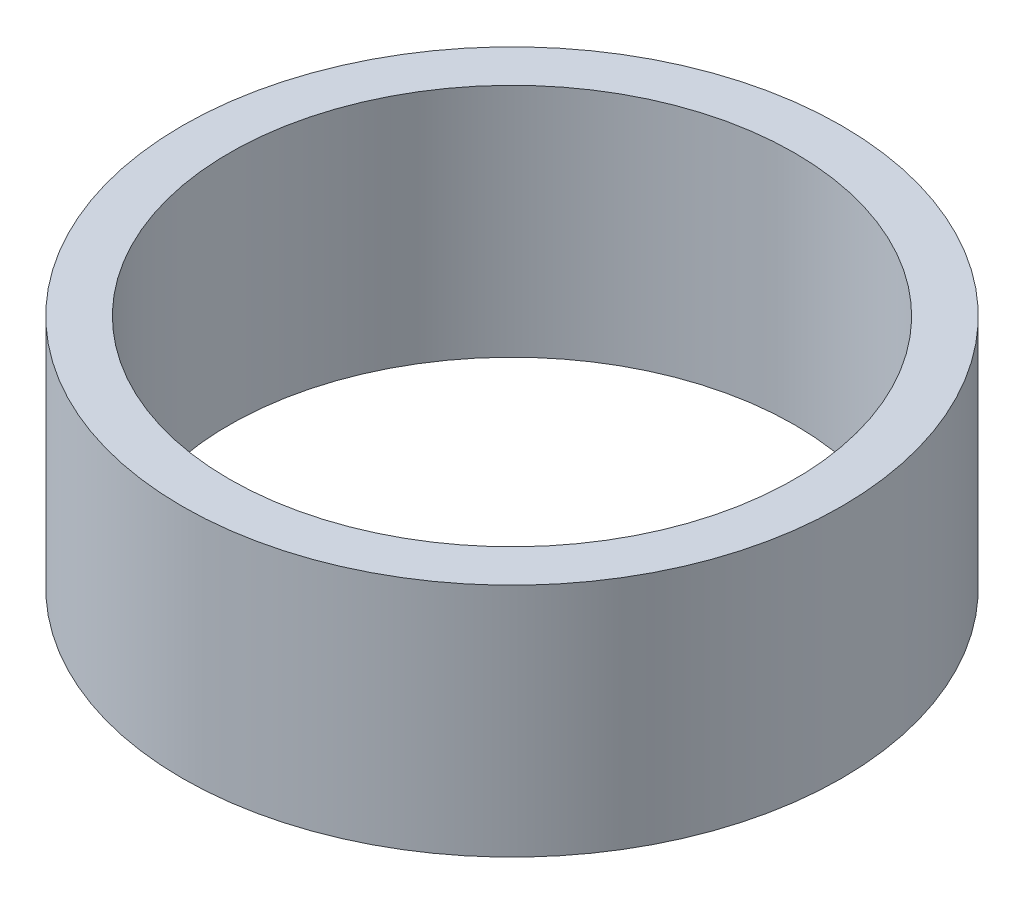
ISO-10303-21;
HEADER;
FILE_DESCRIPTION(('STEP AP214'),'2;1');
FILE_NAME('part.step','',(''),(''),'','','');
FILE_SCHEMA(('AUTOMOTIVE_DESIGN { 1 0 10303 214 1 1 1 1 }'));
ENDSEC;
DATA;
#1=APPLICATION_CONTEXT('core data for automotive mechanical design processes');
#2=APPLICATION_PROTOCOL_DEFINITION('international standard','automotive_design',2000,#1);
#3=PRODUCT_CONTEXT('',#1,'mechanical');
#4=PRODUCT('Part','Part','',(#3));
#5=PRODUCT_RELATED_PRODUCT_CATEGORY('part','',(#4));
#6=PRODUCT_DEFINITION_FORMATION('','',#4);
#7=PRODUCT_DEFINITION_CONTEXT('part definition',#1,'design');
#8=PRODUCT_DEFINITION('design','',#6,#7);
#9=PRODUCT_DEFINITION_SHAPE('','',#8);
#10=(LENGTH_UNIT() NAMED_UNIT(*) SI_UNIT(.MILLI.,.METRE.));
#11=(NAMED_UNIT(*) PLANE_ANGLE_UNIT() SI_UNIT($,.RADIAN.));
#12=(NAMED_UNIT(*) SI_UNIT($,.STERADIAN.) SOLID_ANGLE_UNIT());
#13=UNCERTAINTY_MEASURE_WITH_UNIT(LENGTH_MEASURE(1.E-05),#10,'distance_accuracy_value','');
#14=(GEOMETRIC_REPRESENTATION_CONTEXT(3) GLOBAL_UNCERTAINTY_ASSIGNED_CONTEXT((#13)) GLOBAL_UNIT_ASSIGNED_CONTEXT((#10,
#11,#12)) REPRESENTATION_CONTEXT('',''));
#15=CARTESIAN_POINT('',(0.,0.,0.));
#16=DIRECTION('',(0.,0.,1.));
#17=DIRECTION('',(1.,0.,0.));
#18=AXIS2_PLACEMENT_3D('',#15,#16,#17);
#19=CARTESIAN_POINT('',(0.,15.875,0.));
#20=DIRECTION('',(0.,1.,0.));
#21=DIRECTION('',(0.,0.,1.));
#22=AXIS2_PLACEMENT_3D('',#19,#20,#21);
#23=PLANE('',#22);
#24=CARTESIAN_POINT('',(0.,15.875,0.));
#25=DIRECTION('',(0.,1.,0.));
#26=DIRECTION('',(0.,0.,1.));
#27=AXIS2_PLACEMENT_3D('',#24,#25,#26);
#28=CIRCLE('',#27,22.225);
#29=CARTESIAN_POINT('',(0.,15.875,22.225));
#30=VERTEX_POINT('',#29);
#31=EDGE_CURVE('E10',#30,#30,#28,.T.);
#32=ORIENTED_EDGE('',*,*,#31,.T.);
#33=EDGE_LOOP('',(#32));
#34=FACE_BOUND('',#33,.T.);
#35=CARTESIAN_POINT('',(0.,15.875,0.));
#36=DIRECTION('',(0.,1.,0.));
#37=DIRECTION('',(0.,0.,1.));
#38=AXIS2_PLACEMENT_3D('',#35,#36,#37);
#39=CIRCLE('',#38,19.05);
#40=CARTESIAN_POINT('',(0.,15.875,19.05));
#41=VERTEX_POINT('',#40);
#42=EDGE_CURVE('E42',#41,#41,#39,.T.);
#43=ORIENTED_EDGE('',*,*,#42,.F.);
#44=EDGE_LOOP('',(#43));
#45=FACE_BOUND('',#44,.T.);
#46=ADVANCED_FACE('F31',(#34,#45),#23,.T.);
#47=CARTESIAN_POINT('',(0.,0.,0.));
#48=DIRECTION('',(0.,1.,0.));
#49=DIRECTION('',(0.,0.,1.));
#50=AXIS2_PLACEMENT_3D('',#47,#48,#49);
#51=PLANE('',#50);
#52=CARTESIAN_POINT('',(0.,0.,0.));
#53=DIRECTION('',(0.,1.,0.));
#54=DIRECTION('',(0.,0.,1.));
#55=AXIS2_PLACEMENT_3D('',#52,#53,#54);
#56=CIRCLE('',#55,22.225);
#57=CARTESIAN_POINT('',(0.,0.,22.225));
#58=VERTEX_POINT('',#57);
#59=EDGE_CURVE('E35',#58,#58,#56,.T.);
#60=ORIENTED_EDGE('',*,*,#59,.F.);
#61=EDGE_LOOP('',(#60));
#62=FACE_BOUND('',#61,.T.);
#63=CARTESIAN_POINT('',(0.,0.,0.));
#64=DIRECTION('',(0.,1.,0.));
#65=DIRECTION('',(0.,0.,1.));
#66=AXIS2_PLACEMENT_3D('',#63,#64,#65);
#67=CIRCLE('',#66,19.05);
#68=CARTESIAN_POINT('',(0.,0.,19.05));
#69=VERTEX_POINT('',#68);
#70=EDGE_CURVE('E44',#69,#69,#67,.T.);
#71=ORIENTED_EDGE('',*,*,#70,.T.);
#72=EDGE_LOOP('',(#71));
#73=FACE_BOUND('',#72,.T.);
#74=ADVANCED_FACE('F54',(#62,#73),#51,.F.);
#75=CARTESIAN_POINT('',(0.,15.875,0.));
#76=DIRECTION('',(0.,-1.,0.));
#77=DIRECTION('',(0.,0.,-1.));
#78=AXIS2_PLACEMENT_3D('',#75,#76,#77);
#79=CYLINDRICAL_SURFACE('',#78,22.225);
#80=ORIENTED_EDGE('',*,*,#31,.F.);
#81=EDGE_LOOP('',(#80));
#82=FACE_BOUND('',#81,.T.);
#83=ORIENTED_EDGE('',*,*,#59,.T.);
#84=EDGE_LOOP('',(#83));
#85=FACE_BOUND('',#84,.T.);
#86=ADVANCED_FACE('F33',(#82,#85),#79,.T.);
#87=CARTESIAN_POINT('',(0.,15.875,0.));
#88=DIRECTION('',(0.,-1.,0.));
#89=DIRECTION('',(0.,0.,-1.));
#90=AXIS2_PLACEMENT_3D('',#87,#88,#89);
#91=CYLINDRICAL_SURFACE('',#90,19.05);
#92=ORIENTED_EDGE('',*,*,#42,.T.);
#93=EDGE_LOOP('',(#92));
#94=FACE_BOUND('',#93,.T.);
#95=ORIENTED_EDGE('',*,*,#70,.F.);
#96=EDGE_LOOP('',(#95));
#97=FACE_BOUND('',#96,.T.);
#98=ADVANCED_FACE('F50',(#94,#97),#91,.F.);
#99=CLOSED_SHELL('',(#46,#74,#86,#98));
#100=MANIFOLD_SOLID_BREP('B2',#99);
#101=ADVANCED_BREP_SHAPE_REPRESENTATION('',(#18,#100),#14);
#102=SHAPE_DEFINITION_REPRESENTATION(#9,#101);
ENDSEC;
END-ISO-10303-21;
